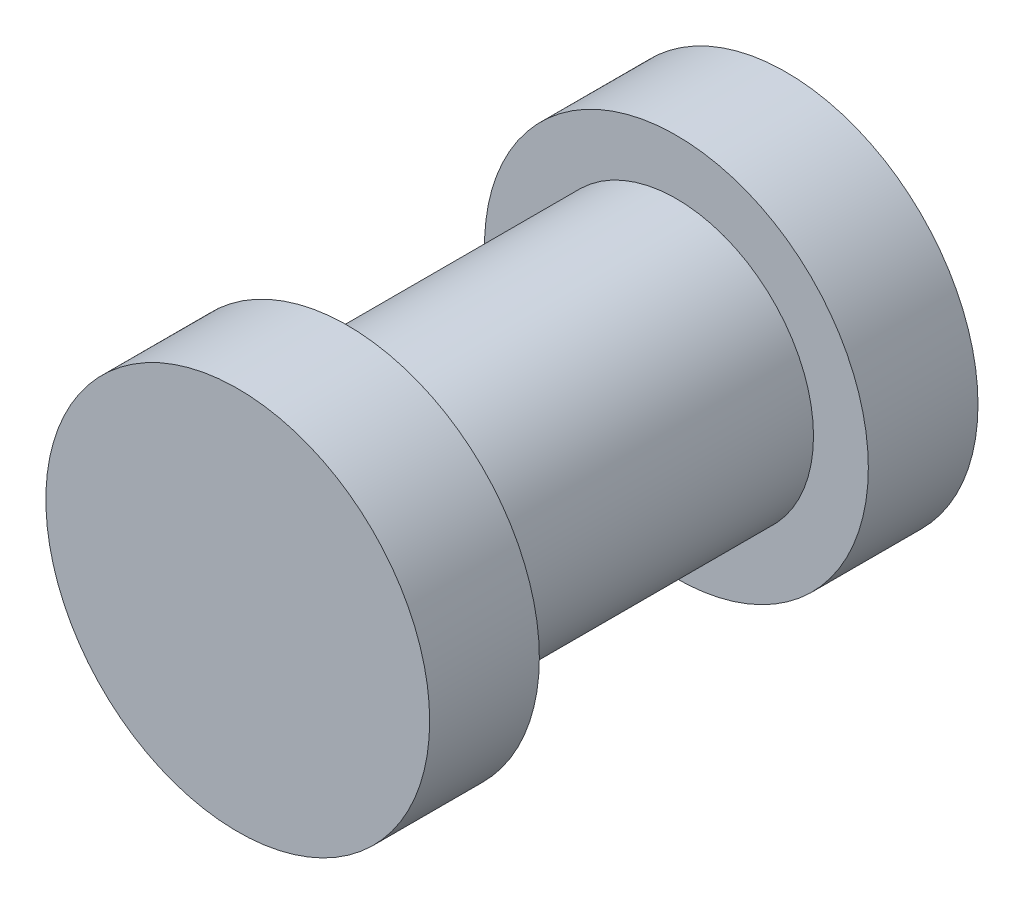
ISO-10303-21;
HEADER;
FILE_DESCRIPTION(('STEP AP214'),'2;1');
FILE_NAME('part.step','',(''),(''),'','','');
FILE_SCHEMA(('AUTOMOTIVE_DESIGN { 1 0 10303 214 1 1 1 1 }'));
ENDSEC;
DATA;
#1=APPLICATION_CONTEXT('core data for automotive mechanical design processes');
#2=APPLICATION_PROTOCOL_DEFINITION('international standard','automotive_design',2000,#1);
#3=PRODUCT_CONTEXT('',#1,'mechanical');
#4=PRODUCT('Part','Part','',(#3));
#5=PRODUCT_RELATED_PRODUCT_CATEGORY('part','',(#4));
#6=PRODUCT_DEFINITION_FORMATION('','',#4);
#7=PRODUCT_DEFINITION_CONTEXT('part definition',#1,'design');
#8=PRODUCT_DEFINITION('design','',#6,#7);
#9=PRODUCT_DEFINITION_SHAPE('','',#8);
#10=(LENGTH_UNIT() NAMED_UNIT(*) SI_UNIT(.MILLI.,.METRE.));
#11=(NAMED_UNIT(*) PLANE_ANGLE_UNIT() SI_UNIT($,.RADIAN.));
#12=(NAMED_UNIT(*) SI_UNIT($,.STERADIAN.) SOLID_ANGLE_UNIT());
#13=UNCERTAINTY_MEASURE_WITH_UNIT(LENGTH_MEASURE(1.E-05),#10,'distance_accuracy_value','');
#14=(GEOMETRIC_REPRESENTATION_CONTEXT(3) GLOBAL_UNCERTAINTY_ASSIGNED_CONTEXT((#13)) GLOBAL_UNIT_ASSIGNED_CONTEXT((#10,
#11,#12)) REPRESENTATION_CONTEXT('',''));
#15=CARTESIAN_POINT('',(0.,0.,0.));
#16=DIRECTION('',(0.,0.,1.));
#17=DIRECTION('',(1.,0.,0.));
#18=AXIS2_PLACEMENT_3D('',#15,#16,#17);
#19=CARTESIAN_POINT('',(0.,0.,10.));
#20=DIRECTION('',(0.,0.,-1.));
#21=DIRECTION('',(-1.,0.,0.));
#22=AXIS2_PLACEMENT_3D('',#19,#20,#21);
#23=CYLINDRICAL_SURFACE('',#22,3.5);
#24=CARTESIAN_POINT('',(0.,0.,8.));
#25=DIRECTION('',(0.,0.,1.));
#26=DIRECTION('',(1.,0.,0.));
#27=AXIS2_PLACEMENT_3D('',#24,#25,#26);
#28=CIRCLE('',#27,3.5);
#29=CARTESIAN_POINT('',(3.5,0.,8.));
#30=VERTEX_POINT('',#29);
#31=EDGE_CURVE('E43',#30,#30,#28,.T.);
#32=ORIENTED_EDGE('',*,*,#31,.T.);
#33=EDGE_LOOP('',(#32));
#34=FACE_BOUND('',#33,.T.);
#35=CARTESIAN_POINT('',(0.,0.,10.));
#36=DIRECTION('',(0.,0.,1.));
#37=DIRECTION('',(1.,0.,0.));
#38=AXIS2_PLACEMENT_3D('',#35,#36,#37);
#39=CIRCLE('',#38,3.5);
#40=CARTESIAN_POINT('',(3.5,0.,10.));
#41=VERTEX_POINT('',#40);
#42=EDGE_CURVE('E10',#41,#41,#39,.T.);
#43=ORIENTED_EDGE('',*,*,#42,.F.);
#44=EDGE_LOOP('',(#43));
#45=FACE_BOUND('',#44,.T.);
#46=ADVANCED_FACE('F33',(#34,#45),#23,.T.);
#47=CARTESIAN_POINT('',(0.,0.,10.));
#48=DIRECTION('',(0.,0.,1.));
#49=DIRECTION('',(1.,0.,0.));
#50=AXIS2_PLACEMENT_3D('',#47,#48,#49);
#51=PLANE('',#50);
#52=ORIENTED_EDGE('',*,*,#42,.T.);
#53=EDGE_LOOP('',(#52));
#54=FACE_BOUND('',#53,.T.);
#55=ADVANCED_FACE('F74',(#54),#51,.T.);
#56=CARTESIAN_POINT('',(0.,0.,8.));
#57=DIRECTION('',(0.,0.,1.));
#58=DIRECTION('',(1.,0.,0.));
#59=AXIS2_PLACEMENT_3D('',#56,#57,#58);
#60=PLANE('',#59);
#61=ORIENTED_EDGE('',*,*,#31,.F.);
#62=EDGE_LOOP('',(#61));
#63=FACE_BOUND('',#62,.T.);
#64=CARTESIAN_POINT('',(0.,0.,8.));
#65=DIRECTION('',(0.,0.,1.));
#66=DIRECTION('',(1.,0.,0.));
#67=AXIS2_PLACEMENT_3D('',#64,#65,#66);
#68=CIRCLE('',#67,2.5);
#69=CARTESIAN_POINT('',(2.5,0.,8.));
#70=VERTEX_POINT('',#69);
#71=EDGE_CURVE('E47',#70,#70,#68,.T.);
#72=ORIENTED_EDGE('',*,*,#71,.T.);
#73=EDGE_LOOP('',(#72));
#74=FACE_BOUND('',#73,.T.);
#75=ADVANCED_FACE('F79',(#63,#74),#60,.F.);
#76=CARTESIAN_POINT('',(0.,0.,8.));
#77=DIRECTION('',(0.,0.,-1.));
#78=DIRECTION('',(-1.,0.,0.));
#79=AXIS2_PLACEMENT_3D('',#76,#77,#78);
#80=CYLINDRICAL_SURFACE('',#79,2.5);
#81=ORIENTED_EDGE('',*,*,#71,.F.);
#82=EDGE_LOOP('',(#81));
#83=FACE_BOUND('',#82,.T.);
#84=CARTESIAN_POINT('',(0.,0.,2.));
#85=DIRECTION('',(0.,0.,1.));
#86=DIRECTION('',(1.,0.,0.));
#87=AXIS2_PLACEMENT_3D('',#84,#85,#86);
#88=CIRCLE('',#87,2.5);
#89=CARTESIAN_POINT('',(2.5,0.,2.));
#90=VERTEX_POINT('',#89);
#91=EDGE_CURVE('E53',#90,#90,#88,.T.);
#92=ORIENTED_EDGE('',*,*,#91,.T.);
#93=EDGE_LOOP('',(#92));
#94=FACE_BOUND('',#93,.T.);
#95=ADVANCED_FACE('F57',(#83,#94),#80,.T.);
#96=CARTESIAN_POINT('',(0.,0.,2.));
#97=DIRECTION('',(0.,0.,1.));
#98=DIRECTION('',(1.,0.,0.));
#99=AXIS2_PLACEMENT_3D('',#96,#97,#98);
#100=PLANE('',#99);
#101=ORIENTED_EDGE('',*,*,#91,.F.);
#102=EDGE_LOOP('',(#101));
#103=FACE_BOUND('',#102,.T.);
#104=CARTESIAN_POINT('',(0.,0.,2.));
#105=DIRECTION('',(0.,0.,1.));
#106=DIRECTION('',(1.,0.,0.));
#107=AXIS2_PLACEMENT_3D('',#104,#105,#106);
#108=CIRCLE('',#107,3.5);
#109=CARTESIAN_POINT('',(3.5,0.,2.));
#110=VERTEX_POINT('',#109);
#111=EDGE_CURVE('E50',#110,#110,#108,.T.);
#112=ORIENTED_EDGE('',*,*,#111,.T.);
#113=EDGE_LOOP('',(#112));
#114=FACE_BOUND('',#113,.T.);
#115=ADVANCED_FACE('F59',(#103,#114),#100,.T.);
#116=CARTESIAN_POINT('',(0.,0.,0.));
#117=DIRECTION('',(0.,0.,1.));
#118=DIRECTION('',(1.,0.,0.));
#119=AXIS2_PLACEMENT_3D('',#116,#117,#118);
#120=PLANE('',#119);
#121=CARTESIAN_POINT('',(0.,0.,0.));
#122=DIRECTION('',(0.,0.,1.));
#123=DIRECTION('',(1.,0.,0.));
#124=AXIS2_PLACEMENT_3D('',#121,#122,#123);
#125=CIRCLE('',#124,3.5);
#126=CARTESIAN_POINT('',(3.5,0.,0.));
#127=VERTEX_POINT('',#126);
#128=EDGE_CURVE('E36',#127,#127,#125,.T.);
#129=ORIENTED_EDGE('',*,*,#128,.F.);
#130=EDGE_LOOP('',(#129));
#131=FACE_BOUND('',#130,.T.);
#132=ADVANCED_FACE('F62',(#131),#120,.F.);
#133=ORIENTED_EDGE('',*,*,#128,.T.);
#134=EDGE_LOOP('',(#133));
#135=FACE_BOUND('',#134,.T.);
#136=ORIENTED_EDGE('',*,*,#111,.F.);
#137=EDGE_LOOP('',(#136));
#138=FACE_BOUND('',#137,.T.);
#139=ADVANCED_FACE('F66',(#135,#138),#23,.T.);
#140=CLOSED_SHELL('',(#46,#55,#75,#95,#115,#132,#139));
#141=MANIFOLD_SOLID_BREP('B2',#140);
#142=ADVANCED_BREP_SHAPE_REPRESENTATION('',(#18,#141),#14);
#143=SHAPE_DEFINITION_REPRESENTATION(#9,#142);
ENDSEC;
END-ISO-10303-21;
